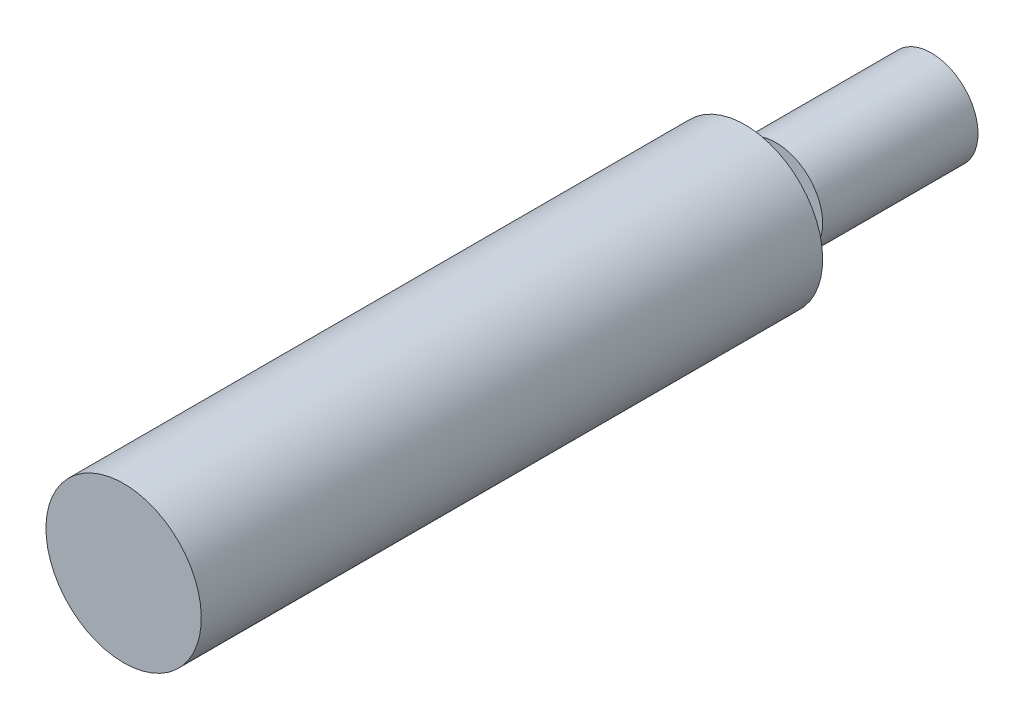
ISO-10303-21;
HEADER;
FILE_DESCRIPTION(('STEP AP214'),'2;1');
FILE_NAME('part.step','',(''),(''),'','','');
FILE_SCHEMA(('AUTOMOTIVE_DESIGN { 1 0 10303 214 1 1 1 1 }'));
ENDSEC;
DATA;
#1=APPLICATION_CONTEXT('core data for automotive mechanical design processes');
#2=APPLICATION_PROTOCOL_DEFINITION('international standard','automotive_design',2000,#1);
#3=PRODUCT_CONTEXT('',#1,'mechanical');
#4=PRODUCT('Part','Part','',(#3));
#5=PRODUCT_RELATED_PRODUCT_CATEGORY('part','',(#4));
#6=PRODUCT_DEFINITION_FORMATION('','',#4);
#7=PRODUCT_DEFINITION_CONTEXT('part definition',#1,'design');
#8=PRODUCT_DEFINITION('design','',#6,#7);
#9=PRODUCT_DEFINITION_SHAPE('','',#8);
#10=(LENGTH_UNIT() NAMED_UNIT(*) SI_UNIT(.MILLI.,.METRE.));
#11=(NAMED_UNIT(*) PLANE_ANGLE_UNIT() SI_UNIT($,.RADIAN.));
#12=(NAMED_UNIT(*) SI_UNIT($,.STERADIAN.) SOLID_ANGLE_UNIT());
#13=UNCERTAINTY_MEASURE_WITH_UNIT(LENGTH_MEASURE(1.E-05),#10,'distance_accuracy_value','');
#14=(GEOMETRIC_REPRESENTATION_CONTEXT(3) GLOBAL_UNCERTAINTY_ASSIGNED_CONTEXT((#13)) GLOBAL_UNIT_ASSIGNED_CONTEXT((#10,
#11,#12)) REPRESENTATION_CONTEXT('',''));
#15=CARTESIAN_POINT('',(0.,0.,0.));
#16=DIRECTION('',(0.,0.,1.));
#17=DIRECTION('',(1.,0.,0.));
#18=AXIS2_PLACEMENT_3D('',#15,#16,#17);
#19=CARTESIAN_POINT('',(0.,0.,-6.));
#20=DIRECTION('',(0.,0.,1.));
#21=DIRECTION('',(0.,-1.,0.));
#22=AXIS2_PLACEMENT_3D('',#19,#20,#21);
#23=PLANE('',#22);
#24=CARTESIAN_POINT('',(0.,0.,-6.));
#25=DIRECTION('',(0.,0.,1.));
#26=DIRECTION('',(0.,-1.,0.));
#27=AXIS2_PLACEMENT_3D('',#24,#25,#26);
#28=CIRCLE('',#27,1.50000000000001);
#29=CARTESIAN_POINT('',(0.,-1.50000000000005,-5.99999999999999));
#30=VERTEX_POINT('',#29);
#31=EDGE_CURVE('E10',#30,#30,#28,.T.);
#32=ORIENTED_EDGE('',*,*,#31,.F.);
#33=EDGE_LOOP('',(#32));
#34=FACE_BOUND('',#33,.T.);
#35=ADVANCED_FACE('F34',(#34),#23,.F.);
#36=CARTESIAN_POINT('',(0.,3.02086212207189E-13,44.6812413574794));
#37=DIRECTION('',(0.,0.,1.));
#38=DIRECTION('',(0.,-1.,0.));
#39=AXIS2_PLACEMENT_3D('',#36,#37,#38);
#40=CYLINDRICAL_SURFACE('',#39,1.5);
#41=CARTESIAN_POINT('',(0.,0.,-1.));
#42=DIRECTION('',(0.,0.,1.));
#43=DIRECTION('',(0.,-1.,0.));
#44=AXIS2_PLACEMENT_3D('',#41,#42,#43);
#45=CIRCLE('',#44,1.5);
#46=CARTESIAN_POINT('',(0.,-1.50000000000001,-0.999999999999991));
#47=VERTEX_POINT('',#46);
#48=EDGE_CURVE('E40',#47,#47,#45,.T.);
#49=ORIENTED_EDGE('',*,*,#48,.F.);
#50=EDGE_LOOP('',(#49));
#51=FACE_BOUND('',#50,.T.);
#52=ORIENTED_EDGE('',*,*,#31,.T.);
#53=EDGE_LOOP('',(#52));
#54=FACE_BOUND('',#53,.T.);
#55=ADVANCED_FACE('F82',(#51,#54),#40,.T.);
#56=CARTESIAN_POINT('',(1.5,0.,-1.));
#57=DIRECTION('',(0.,0.,-1.));
#58=DIRECTION('',(0.,1.,0.));
#59=AXIS2_PLACEMENT_3D('',#56,#57,#58);
#60=PLANE('',#59);
#61=CARTESIAN_POINT('',(0.,0.,-1.));
#62=DIRECTION('',(0.,0.,1.));
#63=DIRECTION('',(0.,-1.,0.));
#64=AXIS2_PLACEMENT_3D('',#61,#62,#63);
#65=CIRCLE('',#64,1.);
#66=CARTESIAN_POINT('',(0.,-1.00000000000001,-0.999999999999994));
#67=VERTEX_POINT('',#66);
#68=EDGE_CURVE('E44',#67,#67,#65,.T.);
#69=ORIENTED_EDGE('',*,*,#68,.F.);
#70=EDGE_LOOP('',(#69));
#71=FACE_BOUND('',#70,.T.);
#72=ORIENTED_EDGE('',*,*,#48,.T.);
#73=EDGE_LOOP('',(#72));
#74=FACE_BOUND('',#73,.T.);
#75=ADVANCED_FACE('F77',(#71,#74),#60,.F.);
#76=CARTESIAN_POINT('',(0.,3.02086212207189E-13,44.6812413574794));
#77=DIRECTION('',(0.,0.,1.));
#78=DIRECTION('',(0.,-1.,0.));
#79=AXIS2_PLACEMENT_3D('',#76,#77,#78);
#80=CYLINDRICAL_SURFACE('',#79,1.);
#81=CARTESIAN_POINT('',(0.,0.,0.));
#82=DIRECTION('',(0.,0.,1.));
#83=DIRECTION('',(0.,-1.,0.));
#84=AXIS2_PLACEMENT_3D('',#81,#82,#83);
#85=CIRCLE('',#84,1.);
#86=CARTESIAN_POINT('',(0.,-1.,0.));
#87=VERTEX_POINT('',#86);
#88=EDGE_CURVE('E48',#87,#87,#85,.T.);
#89=ORIENTED_EDGE('',*,*,#88,.F.);
#90=EDGE_LOOP('',(#89));
#91=FACE_BOUND('',#90,.T.);
#92=ORIENTED_EDGE('',*,*,#68,.T.);
#93=EDGE_LOOP('',(#92));
#94=FACE_BOUND('',#93,.T.);
#95=ADVANCED_FACE('F71',(#91,#94),#80,.T.);
#96=CARTESIAN_POINT('',(2.50000000000002,0.,0.));
#97=DIRECTION('',(0.,0.,1.));
#98=DIRECTION('',(0.,-1.,0.));
#99=AXIS2_PLACEMENT_3D('',#96,#97,#98);
#100=PLANE('',#99);
#101=CARTESIAN_POINT('',(0.,0.,0.));
#102=DIRECTION('',(0.,0.,1.));
#103=DIRECTION('',(0.,-1.,0.));
#104=AXIS2_PLACEMENT_3D('',#101,#102,#103);
#105=CIRCLE('',#104,2.50000000000002);
#106=CARTESIAN_POINT('',(0.,-2.50000000000002,0.));
#107=VERTEX_POINT('',#106);
#108=EDGE_CURVE('E53',#107,#107,#105,.T.);
#109=ORIENTED_EDGE('',*,*,#108,.F.);
#110=EDGE_LOOP('',(#109));
#111=FACE_BOUND('',#110,.T.);
#112=ORIENTED_EDGE('',*,*,#88,.T.);
#113=EDGE_LOOP('',(#112));
#114=FACE_BOUND('',#113,.T.);
#115=ADVANCED_FACE('F65',(#111,#114),#100,.F.);
#116=CARTESIAN_POINT('',(0.,3.02086212207189E-13,44.6812413574794));
#117=DIRECTION('',(0.,0.,1.));
#118=DIRECTION('',(0.,-1.,0.));
#119=AXIS2_PLACEMENT_3D('',#116,#117,#118);
#120=CYLINDRICAL_SURFACE('',#119,2.50000000000001);
#121=CARTESIAN_POINT('',(0.,1.35218361455225E-13,20.));
#122=DIRECTION('',(0.,0.,1.));
#123=DIRECTION('',(0.,-1.,0.));
#124=AXIS2_PLACEMENT_3D('',#121,#122,#123);
#125=CIRCLE('',#124,2.5);
#126=CARTESIAN_POINT('',(0.,-2.49999999999987,20.));
#127=VERTEX_POINT('',#126);
#128=EDGE_CURVE('E56',#127,#127,#125,.T.);
#129=ORIENTED_EDGE('',*,*,#128,.F.);
#130=EDGE_LOOP('',(#129));
#131=FACE_BOUND('',#130,.T.);
#132=ORIENTED_EDGE('',*,*,#108,.T.);
#133=EDGE_LOOP('',(#132));
#134=FACE_BOUND('',#133,.T.);
#135=ADVANCED_FACE('F62',(#131,#134),#120,.T.);
#136=CARTESIAN_POINT('',(0.,1.35218361455225E-13,20.));
#137=DIRECTION('',(0.,0.,-1.));
#138=DIRECTION('',(0.,1.,0.));
#139=AXIS2_PLACEMENT_3D('',#136,#137,#138);
#140=PLANE('',#139);
#141=ORIENTED_EDGE('',*,*,#128,.T.);
#142=EDGE_LOOP('',(#141));
#143=FACE_BOUND('',#142,.T.);
#144=ADVANCED_FACE('F60',(#143),#140,.F.);
#145=CLOSED_SHELL('',(#35,#55,#75,#95,#115,#135,#144));
#146=MANIFOLD_SOLID_BREP('B2',#145);
#147=ADVANCED_BREP_SHAPE_REPRESENTATION('',(#18,#146),#14);
#148=SHAPE_DEFINITION_REPRESENTATION(#9,#147);
ENDSEC;
END-ISO-10303-21;
